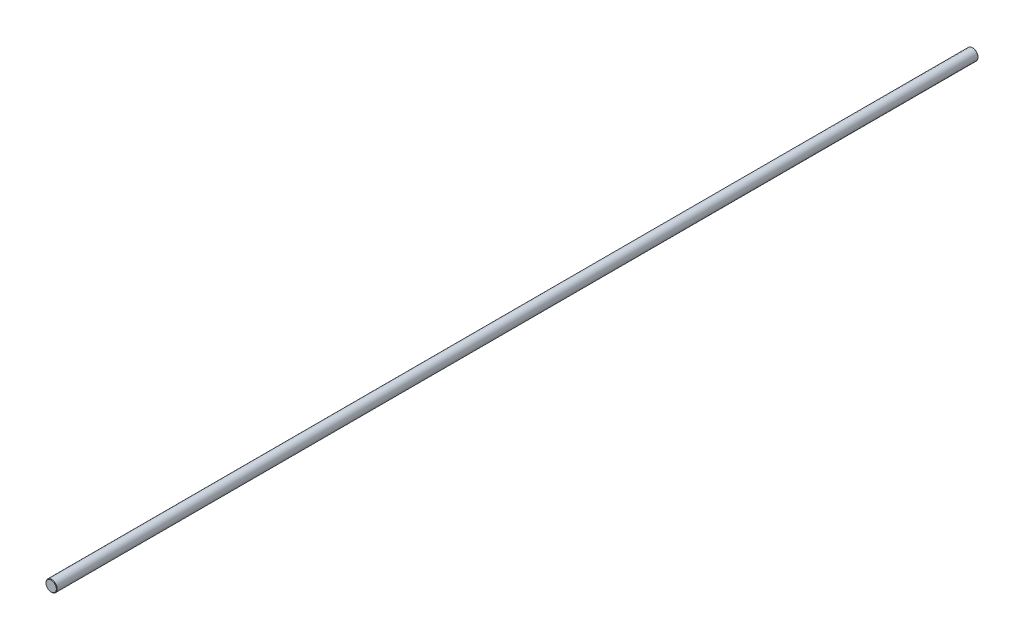
ISO-10303-21;
HEADER;
FILE_DESCRIPTION(('STEP AP214'),'2;1');
FILE_NAME('part.step','',(''),(''),'','','');
FILE_SCHEMA(('AUTOMOTIVE_DESIGN { 1 0 10303 214 1 1 1 1 }'));
ENDSEC;
DATA;
#1=APPLICATION_CONTEXT('core data for automotive mechanical design processes');
#2=APPLICATION_PROTOCOL_DEFINITION('international standard','automotive_design',2000,#1);
#3=PRODUCT_CONTEXT('',#1,'mechanical');
#4=PRODUCT('Part','Part','',(#3));
#5=PRODUCT_RELATED_PRODUCT_CATEGORY('part','',(#4));
#6=PRODUCT_DEFINITION_FORMATION('','',#4);
#7=PRODUCT_DEFINITION_CONTEXT('part definition',#1,'design');
#8=PRODUCT_DEFINITION('design','',#6,#7);
#9=PRODUCT_DEFINITION_SHAPE('','',#8);
#10=(LENGTH_UNIT() NAMED_UNIT(*) SI_UNIT(.MILLI.,.METRE.));
#11=(NAMED_UNIT(*) PLANE_ANGLE_UNIT() SI_UNIT($,.RADIAN.));
#12=(NAMED_UNIT(*) SI_UNIT($,.STERADIAN.) SOLID_ANGLE_UNIT());
#13=UNCERTAINTY_MEASURE_WITH_UNIT(LENGTH_MEASURE(1.E-05),#10,'distance_accuracy_value','');
#14=(GEOMETRIC_REPRESENTATION_CONTEXT(3) GLOBAL_UNCERTAINTY_ASSIGNED_CONTEXT((#13)) GLOBAL_UNIT_ASSIGNED_CONTEXT((#10,
#11,#12)) REPRESENTATION_CONTEXT('',''));
#15=CARTESIAN_POINT('',(0.,0.,0.));
#16=DIRECTION('',(0.,0.,1.));
#17=DIRECTION('',(1.,0.,0.));
#18=AXIS2_PLACEMENT_3D('',#15,#16,#17);
#19=CARTESIAN_POINT('',(0.,0.,1027.));
#20=DIRECTION('',(0.,0.,-1.));
#21=DIRECTION('',(-1.,0.,0.));
#22=AXIS2_PLACEMENT_3D('',#19,#20,#21);
#23=CYLINDRICAL_SURFACE('',#22,12.5);
#24=CARTESIAN_POINT('',(0.,0.,-1026.));
#25=DIRECTION('',(0.,0.,1.));
#26=DIRECTION('',(1.,0.,0.));
#27=AXIS2_PLACEMENT_3D('',#24,#25,#26);
#28=CIRCLE('',#27,12.5);
#29=CARTESIAN_POINT('',(12.5,0.,-1026.));
#30=VERTEX_POINT('',#29);
#31=EDGE_CURVE('E43',#30,#30,#28,.T.);
#32=ORIENTED_EDGE('',*,*,#31,.T.);
#33=EDGE_LOOP('',(#32));
#34=FACE_BOUND('',#33,.T.);
#35=CARTESIAN_POINT('',(0.,0.,1026.));
#36=DIRECTION('',(0.,0.,1.));
#37=DIRECTION('',(1.,0.,0.));
#38=AXIS2_PLACEMENT_3D('',#35,#36,#37);
#39=CIRCLE('',#38,12.5);
#40=CARTESIAN_POINT('',(12.5,0.,1026.));
#41=VERTEX_POINT('',#40);
#42=EDGE_CURVE('E47',#41,#41,#39,.F.);
#43=ORIENTED_EDGE('',*,*,#42,.T.);
#44=EDGE_LOOP('',(#43));
#45=FACE_BOUND('',#44,.T.);
#46=ADVANCED_FACE('F32',(#34,#45),#23,.T.);
#47=CARTESIAN_POINT('',(0.,0.,1027.));
#48=DIRECTION('',(0.,0.,1.));
#49=DIRECTION('',(1.,0.,0.));
#50=AXIS2_PLACEMENT_3D('',#47,#48,#49);
#51=PLANE('',#50);
#52=CARTESIAN_POINT('',(0.,0.,1027.));
#53=DIRECTION('',(0.,0.,1.));
#54=DIRECTION('',(1.,0.,0.));
#55=AXIS2_PLACEMENT_3D('',#52,#53,#54);
#56=CIRCLE('',#55,11.5000000000005);
#57=CARTESIAN_POINT('',(11.5000000000005,0.,1027.));
#58=VERTEX_POINT('',#57);
#59=EDGE_CURVE('E10',#58,#58,#56,.T.);
#60=ORIENTED_EDGE('',*,*,#59,.T.);
#61=EDGE_LOOP('',(#60));
#62=FACE_BOUND('',#61,.T.);
#63=ADVANCED_FACE('F63',(#62),#51,.T.);
#64=CARTESIAN_POINT('',(0.,0.,-1027.));
#65=DIRECTION('',(0.,0.,1.));
#66=DIRECTION('',(1.,0.,0.));
#67=AXIS2_PLACEMENT_3D('',#64,#65,#66);
#68=PLANE('',#67);
#69=CARTESIAN_POINT('',(0.,0.,-1027.));
#70=DIRECTION('',(0.,0.,1.));
#71=DIRECTION('',(1.,0.,0.));
#72=AXIS2_PLACEMENT_3D('',#69,#70,#71);
#73=CIRCLE('',#72,11.4999999999998);
#74=CARTESIAN_POINT('',(11.4999999999998,0.,-1027.));
#75=VERTEX_POINT('',#74);
#76=EDGE_CURVE('E39',#75,#75,#73,.F.);
#77=ORIENTED_EDGE('',*,*,#76,.T.);
#78=EDGE_LOOP('',(#77));
#79=FACE_BOUND('',#78,.T.);
#80=ADVANCED_FACE('F60',(#79),#68,.F.);
#81=CARTESIAN_POINT('',(0.,0.,-1026.));
#82=DIRECTION('',(0.,0.,1.));
#83=DIRECTION('',(1.,0.,0.));
#84=AXIS2_PLACEMENT_3D('',#81,#82,#83);
#85=CONICAL_SURFACE('',#84,12.5,0.785398163397582);
#86=ORIENTED_EDGE('',*,*,#76,.F.);
#87=EDGE_LOOP('',(#86));
#88=FACE_BOUND('',#87,.T.);
#89=ORIENTED_EDGE('',*,*,#31,.F.);
#90=EDGE_LOOP('',(#89));
#91=FACE_BOUND('',#90,.T.);
#92=ADVANCED_FACE('F56',(#88,#91),#85,.T.);
#93=CARTESIAN_POINT('',(0.,0.,1027.));
#94=DIRECTION('',(0.,0.,-1.));
#95=DIRECTION('',(-1.,0.,0.));
#96=AXIS2_PLACEMENT_3D('',#93,#94,#95);
#97=CONICAL_SURFACE('',#96,11.5000000000005,0.785398163397582);
#98=ORIENTED_EDGE('',*,*,#42,.F.);
#99=EDGE_LOOP('',(#98));
#100=FACE_BOUND('',#99,.T.);
#101=ORIENTED_EDGE('',*,*,#59,.F.);
#102=EDGE_LOOP('',(#101));
#103=FACE_BOUND('',#102,.T.);
#104=ADVANCED_FACE('F34',(#100,#103),#97,.T.);
#105=CLOSED_SHELL('',(#46,#63,#80,#92,#104));
#106=MANIFOLD_SOLID_BREP('B2',#105);
#107=ADVANCED_BREP_SHAPE_REPRESENTATION('',(#18,#106),#14);
#108=SHAPE_DEFINITION_REPRESENTATION(#9,#107);
ENDSEC;
END-ISO-10303-21;
